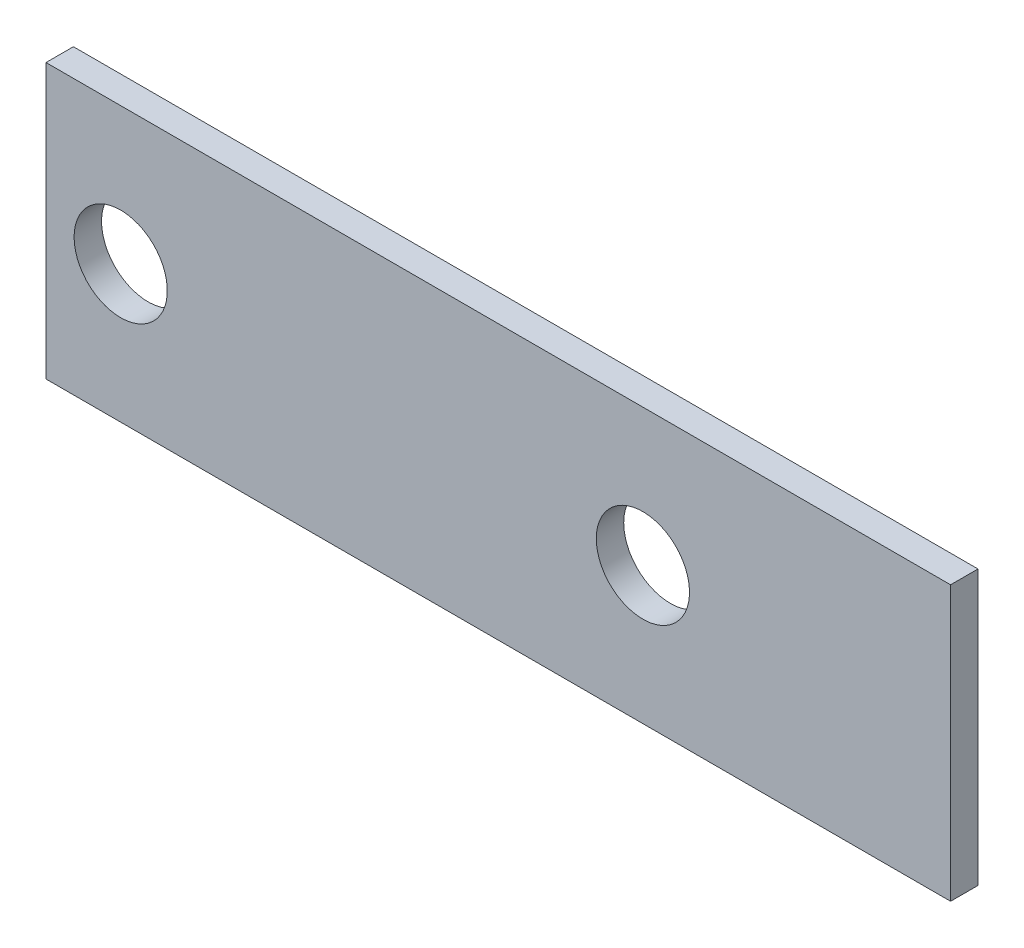
ISO-10303-21;
HEADER;
FILE_DESCRIPTION(('STEP AP214'),'2;1');
FILE_NAME('part.step','',(''),(''),'','','');
FILE_SCHEMA(('AUTOMOTIVE_DESIGN { 1 0 10303 214 1 1 1 1 }'));
ENDSEC;
DATA;
#1=APPLICATION_CONTEXT('core data for automotive mechanical design processes');
#2=APPLICATION_PROTOCOL_DEFINITION('international standard','automotive_design',2000,#1);
#3=PRODUCT_CONTEXT('',#1,'mechanical');
#4=PRODUCT('Part','Part','',(#3));
#5=PRODUCT_RELATED_PRODUCT_CATEGORY('part','',(#4));
#6=PRODUCT_DEFINITION_FORMATION('','',#4);
#7=PRODUCT_DEFINITION_CONTEXT('part definition',#1,'design');
#8=PRODUCT_DEFINITION('design','',#6,#7);
#9=PRODUCT_DEFINITION_SHAPE('','',#8);
#10=(LENGTH_UNIT() NAMED_UNIT(*) SI_UNIT(.MILLI.,.METRE.));
#11=(NAMED_UNIT(*) PLANE_ANGLE_UNIT() SI_UNIT($,.RADIAN.));
#12=(NAMED_UNIT(*) SI_UNIT($,.STERADIAN.) SOLID_ANGLE_UNIT());
#13=UNCERTAINTY_MEASURE_WITH_UNIT(LENGTH_MEASURE(1.E-05),#10,'distance_accuracy_value','');
#14=(GEOMETRIC_REPRESENTATION_CONTEXT(3) GLOBAL_UNCERTAINTY_ASSIGNED_CONTEXT((#13)) GLOBAL_UNIT_ASSIGNED_CONTEXT((#10,
#11,#12)) REPRESENTATION_CONTEXT('',''));
#15=CARTESIAN_POINT('',(0.,0.,0.));
#16=DIRECTION('',(0.,0.,1.));
#17=DIRECTION('',(1.,0.,0.));
#18=AXIS2_PLACEMENT_3D('',#15,#16,#17);
#19=CARTESIAN_POINT('',(-12.25,-5.,1.));
#20=DIRECTION('',(1.,0.,0.));
#21=DIRECTION('',(0.,0.707106781186548,0.707106781186548));
#22=AXIS2_PLACEMENT_3D('',#19,#20,#21);
#23=PLANE('',#22);
#24=DIRECTION('',(0.,-1.,0.));
#25=VECTOR('',#24,1.);
#26=CARTESIAN_POINT('',(-12.25,5.,0.));
#27=LINE('',#26,#25);
#28=CARTESIAN_POINT('',(-12.25,5.,0.));
#29=VERTEX_POINT('',#28);
#30=CARTESIAN_POINT('',(-12.25,-5.,0.));
#31=VERTEX_POINT('',#30);
#32=EDGE_CURVE('E11',#29,#31,#27,.T.);
#33=ORIENTED_EDGE('',*,*,#32,.T.);
#34=DIRECTION('',(0.,0.,-1.));
#35=VECTOR('',#34,1.);
#36=CARTESIAN_POINT('',(-12.25,-5.,1.));
#37=LINE('',#36,#35);
#38=CARTESIAN_POINT('',(-12.25,-5.,1.));
#39=VERTEX_POINT('',#38);
#40=EDGE_CURVE('E36',#39,#31,#37,.T.);
#41=ORIENTED_EDGE('',*,*,#40,.F.);
#42=DIRECTION('',(0.,-1.,0.));
#43=VECTOR('',#42,1.);
#44=CARTESIAN_POINT('',(-12.25,5.,1.));
#45=LINE('',#44,#43);
#46=CARTESIAN_POINT('',(-12.25,5.,1.));
#47=VERTEX_POINT('',#46);
#48=EDGE_CURVE('E92',#47,#39,#45,.T.);
#49=ORIENTED_EDGE('',*,*,#48,.F.);
#50=DIRECTION('',(0.,0.,-1.));
#51=VECTOR('',#50,1.);
#52=CARTESIAN_POINT('',(-12.25,5.,1.));
#53=LINE('',#52,#51);
#54=EDGE_CURVE('E27',#47,#29,#53,.T.);
#55=ORIENTED_EDGE('',*,*,#54,.T.);
#56=EDGE_LOOP('',(#33,#41,#49,#55));
#57=FACE_BOUND('',#56,.T.);
#58=ADVANCED_FACE('F17',(#57),#23,.F.);
#59=CARTESIAN_POINT('',(-12.25,-5.,1.));
#60=DIRECTION('',(0.,1.,0.));
#61=DIRECTION('',(0.707106781186548,0.,0.707106781186548));
#62=AXIS2_PLACEMENT_3D('',#59,#60,#61);
#63=PLANE('',#62);
#64=DIRECTION('',(1.,0.,0.));
#65=VECTOR('',#64,1.);
#66=CARTESIAN_POINT('',(-12.25,-5.,0.));
#67=LINE('',#66,#65);
#68=CARTESIAN_POINT('',(20.75,-5.,0.));
#69=VERTEX_POINT('',#68);
#70=EDGE_CURVE('E98',#31,#69,#67,.T.);
#71=ORIENTED_EDGE('',*,*,#70,.T.);
#72=DIRECTION('',(0.,0.,-1.));
#73=VECTOR('',#72,1.);
#74=CARTESIAN_POINT('',(20.75,-5.,1.));
#75=LINE('',#74,#73);
#76=CARTESIAN_POINT('',(20.75,-5.,1.));
#77=VERTEX_POINT('',#76);
#78=EDGE_CURVE('E87',#77,#69,#75,.T.);
#79=ORIENTED_EDGE('',*,*,#78,.F.);
#80=DIRECTION('',(1.,0.,0.));
#81=VECTOR('',#80,1.);
#82=CARTESIAN_POINT('',(-12.25,-5.,1.));
#83=LINE('',#82,#81);
#84=EDGE_CURVE('E90',#39,#77,#83,.T.);
#85=ORIENTED_EDGE('',*,*,#84,.F.);
#86=ORIENTED_EDGE('',*,*,#40,.T.);
#87=EDGE_LOOP('',(#71,#79,#85,#86));
#88=FACE_BOUND('',#87,.T.);
#89=ADVANCED_FACE('F112',(#88),#63,.F.);
#90=CARTESIAN_POINT('',(20.75,-5.,1.));
#91=DIRECTION('',(-1.,0.,0.));
#92=DIRECTION('',(0.,0.707106781186548,0.707106781186548));
#93=AXIS2_PLACEMENT_3D('',#90,#91,#92);
#94=PLANE('',#93);
#95=DIRECTION('',(0.,1.,0.));
#96=VECTOR('',#95,1.);
#97=CARTESIAN_POINT('',(20.75,-5.,0.));
#98=LINE('',#97,#96);
#99=CARTESIAN_POINT('',(20.75,5.,0.));
#100=VERTEX_POINT('',#99);
#101=EDGE_CURVE('E93',#69,#100,#98,.T.);
#102=ORIENTED_EDGE('',*,*,#101,.T.);
#103=DIRECTION('',(0.,0.,-1.));
#104=VECTOR('',#103,1.);
#105=CARTESIAN_POINT('',(20.75,5.,1.));
#106=LINE('',#105,#104);
#107=CARTESIAN_POINT('',(20.75,5.,1.));
#108=VERTEX_POINT('',#107);
#109=EDGE_CURVE('E88',#108,#100,#106,.T.);
#110=ORIENTED_EDGE('',*,*,#109,.F.);
#111=DIRECTION('',(0.,1.,0.));
#112=VECTOR('',#111,1.);
#113=CARTESIAN_POINT('',(20.75,-5.,1.));
#114=LINE('',#113,#112);
#115=EDGE_CURVE('E83',#77,#108,#114,.T.);
#116=ORIENTED_EDGE('',*,*,#115,.F.);
#117=ORIENTED_EDGE('',*,*,#78,.T.);
#118=EDGE_LOOP('',(#102,#110,#116,#117));
#119=FACE_BOUND('',#118,.T.);
#120=ADVANCED_FACE('F117',(#119),#94,.F.);
#121=CARTESIAN_POINT('',(-12.25,5.,1.));
#122=DIRECTION('',(0.,-1.,0.));
#123=DIRECTION('',(0.707106781186548,0.,0.707106781186548));
#124=AXIS2_PLACEMENT_3D('',#121,#122,#123);
#125=PLANE('',#124);
#126=DIRECTION('',(-1.,0.,0.));
#127=VECTOR('',#126,1.);
#128=CARTESIAN_POINT('',(20.75,5.,0.));
#129=LINE('',#128,#127);
#130=EDGE_CURVE('E84',#100,#29,#129,.T.);
#131=ORIENTED_EDGE('',*,*,#130,.T.);
#132=ORIENTED_EDGE('',*,*,#54,.F.);
#133=DIRECTION('',(-1.,0.,0.));
#134=VECTOR('',#133,1.);
#135=CARTESIAN_POINT('',(20.75,5.,1.));
#136=LINE('',#135,#134);
#137=EDGE_CURVE('E80',#108,#47,#136,.T.);
#138=ORIENTED_EDGE('',*,*,#137,.F.);
#139=ORIENTED_EDGE('',*,*,#109,.T.);
#140=EDGE_LOOP('',(#131,#132,#138,#139));
#141=FACE_BOUND('',#140,.T.);
#142=ADVANCED_FACE('F120',(#141),#125,.F.);
#143=CARTESIAN_POINT('',(0.,0.,1.));
#144=DIRECTION('',(0.,0.,-1.));
#145=DIRECTION('',(0.707106781186548,0.707106781186548,0.));
#146=AXIS2_PLACEMENT_3D('',#143,#144,#145);
#147=PLANE('',#146);
#148=ORIENTED_EDGE('',*,*,#48,.T.);
#149=ORIENTED_EDGE('',*,*,#84,.T.);
#150=ORIENTED_EDGE('',*,*,#115,.T.);
#151=ORIENTED_EDGE('',*,*,#137,.T.);
#152=EDGE_LOOP('',(#148,#149,#150,#151));
#153=FACE_BOUND('',#152,.T.);
#154=CARTESIAN_POINT('',(-9.525,0.,1.));
#155=DIRECTION('',(0.,0.,-1.));
#156=DIRECTION('',(-1.,0.,0.));
#157=AXIS2_PLACEMENT_3D('',#154,#155,#156);
#158=CIRCLE('',#157,1.7);
#159=CARTESIAN_POINT('',(-11.225,0.,1.));
#160=VERTEX_POINT('',#159);
#161=EDGE_CURVE('E74',#160,#160,#158,.T.);
#162=ORIENTED_EDGE('',*,*,#161,.T.);
#163=EDGE_LOOP('',(#162));
#164=FACE_BOUND('',#163,.T.);
#165=CARTESIAN_POINT('',(9.525,0.,1.));
#166=DIRECTION('',(0.,0.,-1.));
#167=DIRECTION('',(-1.,0.,0.));
#168=AXIS2_PLACEMENT_3D('',#165,#166,#167);
#169=CIRCLE('',#168,1.7);
#170=CARTESIAN_POINT('',(7.825,0.,1.));
#171=VERTEX_POINT('',#170);
#172=EDGE_CURVE('E72',#171,#171,#169,.T.);
#173=ORIENTED_EDGE('',*,*,#172,.T.);
#174=EDGE_LOOP('',(#173));
#175=FACE_BOUND('',#174,.T.);
#176=ADVANCED_FACE('F104',(#153,#164,#175),#147,.F.);
#177=CARTESIAN_POINT('',(0.,0.,0.));
#178=DIRECTION('',(0.,0.,-1.));
#179=DIRECTION('',(0.707106781186548,0.707106781186548,0.));
#180=AXIS2_PLACEMENT_3D('',#177,#178,#179);
#181=PLANE('',#180);
#182=ORIENTED_EDGE('',*,*,#32,.F.);
#183=ORIENTED_EDGE('',*,*,#130,.F.);
#184=ORIENTED_EDGE('',*,*,#101,.F.);
#185=ORIENTED_EDGE('',*,*,#70,.F.);
#186=EDGE_LOOP('',(#182,#183,#184,#185));
#187=FACE_BOUND('',#186,.T.);
#188=CARTESIAN_POINT('',(-9.525,0.,0.));
#189=DIRECTION('',(0.,0.,-1.));
#190=DIRECTION('',(-1.,0.,0.));
#191=AXIS2_PLACEMENT_3D('',#188,#189,#190);
#192=CIRCLE('',#191,1.7);
#193=CARTESIAN_POINT('',(-11.225,0.,0.));
#194=VERTEX_POINT('',#193);
#195=EDGE_CURVE('E66',#194,#194,#192,.T.);
#196=ORIENTED_EDGE('',*,*,#195,.F.);
#197=EDGE_LOOP('',(#196));
#198=FACE_BOUND('',#197,.T.);
#199=CARTESIAN_POINT('',(9.525,0.,0.));
#200=DIRECTION('',(0.,0.,-1.));
#201=DIRECTION('',(-1.,0.,0.));
#202=AXIS2_PLACEMENT_3D('',#199,#200,#201);
#203=CIRCLE('',#202,1.7);
#204=CARTESIAN_POINT('',(7.825,0.,0.));
#205=VERTEX_POINT('',#204);
#206=EDGE_CURVE('E21',#205,#205,#203,.T.);
#207=ORIENTED_EDGE('',*,*,#206,.F.);
#208=EDGE_LOOP('',(#207));
#209=FACE_BOUND('',#208,.T.);
#210=ADVANCED_FACE('F70',(#187,#198,#209),#181,.T.);
#211=CARTESIAN_POINT('',(9.525,0.,0.));
#212=DIRECTION('',(0.,0.,-1.));
#213=DIRECTION('',(-1.,0.,0.));
#214=AXIS2_PLACEMENT_3D('',#211,#212,#213);
#215=CYLINDRICAL_SURFACE('',#214,1.7);
#216=ORIENTED_EDGE('',*,*,#172,.F.);
#217=EDGE_LOOP('',(#216));
#218=FACE_BOUND('',#217,.T.);
#219=ORIENTED_EDGE('',*,*,#206,.T.);
#220=EDGE_LOOP('',(#219));
#221=FACE_BOUND('',#220,.T.);
#222=ADVANCED_FACE('F123',(#218,#221),#215,.F.);
#223=CARTESIAN_POINT('',(-9.525,0.,0.));
#224=DIRECTION('',(0.,0.,-1.));
#225=DIRECTION('',(-1.,0.,0.));
#226=AXIS2_PLACEMENT_3D('',#223,#224,#225);
#227=CYLINDRICAL_SURFACE('',#226,1.7);
#228=ORIENTED_EDGE('',*,*,#161,.F.);
#229=EDGE_LOOP('',(#228));
#230=FACE_BOUND('',#229,.T.);
#231=ORIENTED_EDGE('',*,*,#195,.T.);
#232=EDGE_LOOP('',(#231));
#233=FACE_BOUND('',#232,.T.);
#234=ADVANCED_FACE('F19',(#230,#233),#227,.F.);
#235=CLOSED_SHELL('',(#58,#89,#120,#142,#176,#210,#222,#234));
#236=MANIFOLD_SOLID_BREP('B1',#235);
#237=ADVANCED_BREP_SHAPE_REPRESENTATION('',(#18,#236),#14);
#238=SHAPE_DEFINITION_REPRESENTATION(#9,#237);
ENDSEC;
END-ISO-10303-21;
